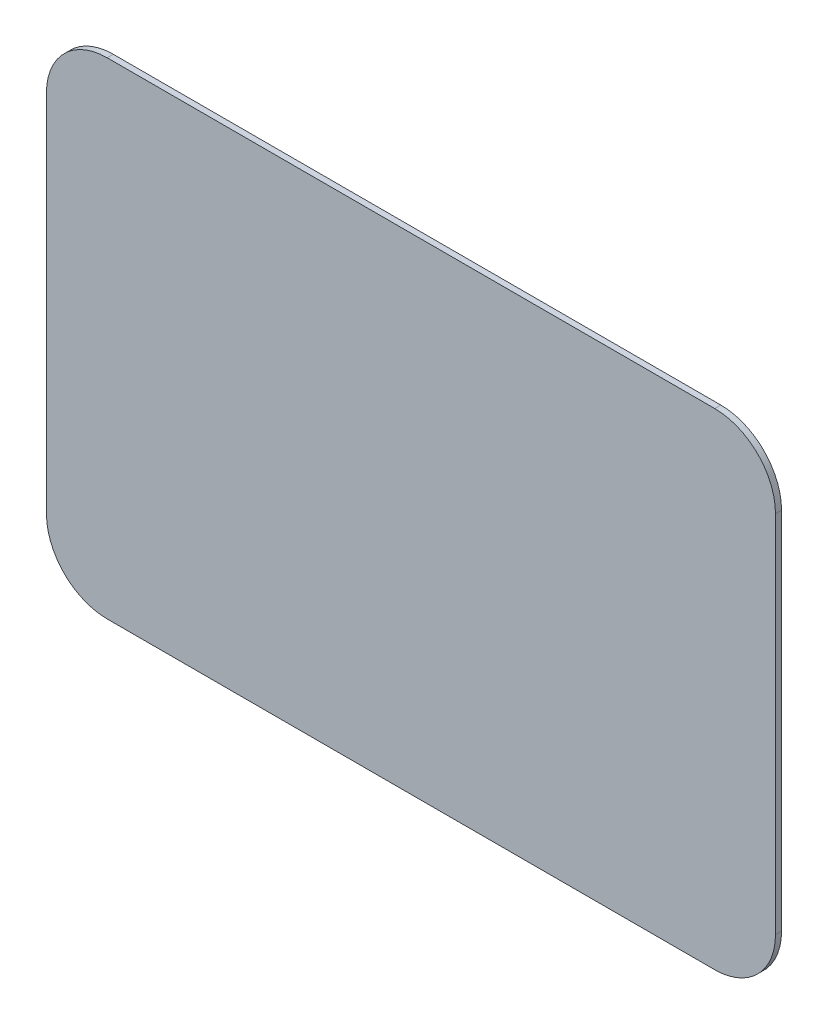
ISO-10303-21;
HEADER;
FILE_DESCRIPTION(('STEP AP214'),'2;1');
FILE_NAME('part.step','',(''),(''),'','','');
FILE_SCHEMA(('AUTOMOTIVE_DESIGN { 1 0 10303 214 1 1 1 1 }'));
ENDSEC;
DATA;
#1=APPLICATION_CONTEXT('core data for automotive mechanical design processes');
#2=APPLICATION_PROTOCOL_DEFINITION('international standard','automotive_design',2000,#1);
#3=PRODUCT_CONTEXT('',#1,'mechanical');
#4=PRODUCT('Part','Part','',(#3));
#5=PRODUCT_RELATED_PRODUCT_CATEGORY('part','',(#4));
#6=PRODUCT_DEFINITION_FORMATION('','',#4);
#7=PRODUCT_DEFINITION_CONTEXT('part definition',#1,'design');
#8=PRODUCT_DEFINITION('design','',#6,#7);
#9=PRODUCT_DEFINITION_SHAPE('','',#8);
#10=(LENGTH_UNIT() NAMED_UNIT(*) SI_UNIT(.MILLI.,.METRE.));
#11=(NAMED_UNIT(*) PLANE_ANGLE_UNIT() SI_UNIT($,.RADIAN.));
#12=(NAMED_UNIT(*) SI_UNIT($,.STERADIAN.) SOLID_ANGLE_UNIT());
#13=UNCERTAINTY_MEASURE_WITH_UNIT(LENGTH_MEASURE(1.E-05),#10,'distance_accuracy_value','');
#14=(GEOMETRIC_REPRESENTATION_CONTEXT(3) GLOBAL_UNCERTAINTY_ASSIGNED_CONTEXT((#13)) GLOBAL_UNIT_ASSIGNED_CONTEXT((#10,
#11,#12)) REPRESENTATION_CONTEXT('',''));
#15=CARTESIAN_POINT('',(0.,0.,0.));
#16=DIRECTION('',(0.,0.,1.));
#17=DIRECTION('',(1.,0.,0.));
#18=AXIS2_PLACEMENT_3D('',#15,#16,#17);
#19=CARTESIAN_POINT('',(-6.,-4.,0.1));
#20=DIRECTION('',(0.,0.,1.));
#21=DIRECTION('',(1.,0.,0.));
#22=AXIS2_PLACEMENT_3D('',#19,#20,#21);
#23=PLANE('',#22);
#24=DIRECTION('',(0.,1.,0.));
#25=VECTOR('',#24,1.);
#26=CARTESIAN_POINT('',(-6.,4.,0.1));
#27=LINE('',#26,#25);
#28=CARTESIAN_POINT('',(-6.,3.,0.1));
#29=VERTEX_POINT('',#28);
#30=CARTESIAN_POINT('',(-6.,-3.,0.1));
#31=VERTEX_POINT('',#30);
#32=EDGE_CURVE('E110',#29,#31,#27,.F.);
#33=ORIENTED_EDGE('',*,*,#32,.T.);
#34=CARTESIAN_POINT('',(-5.,-3.,0.1));
#35=DIRECTION('',(0.,0.,-1.));
#36=DIRECTION('',(-1.,0.,0.));
#37=AXIS2_PLACEMENT_3D('',#34,#35,#36);
#38=CIRCLE('',#37,1.);
#39=CARTESIAN_POINT('',(-5.,-4.,0.1));
#40=VERTEX_POINT('',#39);
#41=EDGE_CURVE('E111',#40,#31,#38,.T.);
#42=ORIENTED_EDGE('',*,*,#41,.F.);
#43=DIRECTION('',(1.,0.,0.));
#44=VECTOR('',#43,1.);
#45=CARTESIAN_POINT('',(-6.,-4.,0.1));
#46=LINE('',#45,#44);
#47=CARTESIAN_POINT('',(5.,-4.,0.1));
#48=VERTEX_POINT('',#47);
#49=EDGE_CURVE('E105',#40,#48,#46,.T.);
#50=ORIENTED_EDGE('',*,*,#49,.T.);
#51=CARTESIAN_POINT('',(5.00000000000001,-3.,0.1));
#52=DIRECTION('',(0.,0.,-1.));
#53=DIRECTION('',(-1.,0.,0.));
#54=AXIS2_PLACEMENT_3D('',#51,#52,#53);
#55=CIRCLE('',#54,1.);
#56=CARTESIAN_POINT('',(6.00000000000001,-3.,0.1));
#57=VERTEX_POINT('',#56);
#58=EDGE_CURVE('E108',#57,#48,#55,.T.);
#59=ORIENTED_EDGE('',*,*,#58,.F.);
#60=DIRECTION('',(0.,1.,0.));
#61=VECTOR('',#60,1.);
#62=CARTESIAN_POINT('',(6.00000000000001,4.,0.1));
#63=LINE('',#62,#61);
#64=CARTESIAN_POINT('',(6.00000000000001,3.,0.1));
#65=VERTEX_POINT('',#64);
#66=EDGE_CURVE('E84',#57,#65,#63,.T.);
#67=ORIENTED_EDGE('',*,*,#66,.T.);
#68=CARTESIAN_POINT('',(5.,3.,0.1));
#69=DIRECTION('',(0.,0.,-1.));
#70=DIRECTION('',(-1.,0.,0.));
#71=AXIS2_PLACEMENT_3D('',#68,#69,#70);
#72=CIRCLE('',#71,1.);
#73=CARTESIAN_POINT('',(5.,4.,0.1));
#74=VERTEX_POINT('',#73);
#75=EDGE_CURVE('E20',#74,#65,#72,.T.);
#76=ORIENTED_EDGE('',*,*,#75,.F.);
#77=DIRECTION('',(1.,0.,0.));
#78=VECTOR('',#77,1.);
#79=CARTESIAN_POINT('',(-6.,4.,0.1));
#80=LINE('',#79,#78);
#81=CARTESIAN_POINT('',(-5.,4.,0.1));
#82=VERTEX_POINT('',#81);
#83=EDGE_CURVE('E82',#74,#82,#80,.F.);
#84=ORIENTED_EDGE('',*,*,#83,.T.);
#85=CARTESIAN_POINT('',(-5.,3.,0.1));
#86=DIRECTION('',(0.,0.,-1.));
#87=DIRECTION('',(-1.,0.,0.));
#88=AXIS2_PLACEMENT_3D('',#85,#86,#87);
#89=CIRCLE('',#88,1.);
#90=EDGE_CURVE('E95',#29,#82,#89,.T.);
#91=ORIENTED_EDGE('',*,*,#90,.F.);
#92=EDGE_LOOP('',(#33,#42,#50,#59,#67,#76,#84,#91));
#93=FACE_BOUND('',#92,.T.);
#94=ADVANCED_FACE('F17',(#93),#23,.T.);
#95=CARTESIAN_POINT('',(5.,3.,0.1));
#96=DIRECTION('',(0.,0.,-1.));
#97=DIRECTION('',(-1.,0.,0.));
#98=AXIS2_PLACEMENT_3D('',#95,#96,#97);
#99=CYLINDRICAL_SURFACE('',#98,1.);
#100=CARTESIAN_POINT('',(5.,3.,0.));
#101=DIRECTION('',(0.,0.,-1.));
#102=DIRECTION('',(-1.,0.,0.));
#103=AXIS2_PLACEMENT_3D('',#100,#101,#102);
#104=CIRCLE('',#103,1.);
#105=CARTESIAN_POINT('',(6.00000000000001,3.,0.));
#106=VERTEX_POINT('',#105);
#107=CARTESIAN_POINT('',(5.,4.,0.));
#108=VERTEX_POINT('',#107);
#109=EDGE_CURVE('E99',#106,#108,#104,.F.);
#110=ORIENTED_EDGE('',*,*,#109,.T.);
#111=DIRECTION('',(0.,0.,-1.));
#112=VECTOR('',#111,1.);
#113=CARTESIAN_POINT('',(5.,4.,0.1));
#114=LINE('',#113,#112);
#115=EDGE_CURVE('E89',#108,#74,#114,.F.);
#116=ORIENTED_EDGE('',*,*,#115,.T.);
#117=ORIENTED_EDGE('',*,*,#75,.T.);
#118=DIRECTION('',(0.,0.,1.));
#119=VECTOR('',#118,1.);
#120=CARTESIAN_POINT('',(6.00000000000001,3.,0.1));
#121=LINE('',#120,#119);
#122=EDGE_CURVE('E137',#65,#106,#121,.F.);
#123=ORIENTED_EDGE('',*,*,#122,.T.);
#124=EDGE_LOOP('',(#110,#116,#117,#123));
#125=FACE_BOUND('',#124,.T.);
#126=ADVANCED_FACE('F98',(#125),#99,.T.);
#127=CARTESIAN_POINT('',(-6.,4.,0.1));
#128=DIRECTION('',(0.,-1.,0.));
#129=DIRECTION('',(0.,0.,-1.));
#130=AXIS2_PLACEMENT_3D('',#127,#128,#129);
#131=PLANE('',#130);
#132=ORIENTED_EDGE('',*,*,#115,.F.);
#133=DIRECTION('',(1.,0.,0.));
#134=VECTOR('',#133,1.);
#135=CARTESIAN_POINT('',(-6.,4.,0.));
#136=LINE('',#135,#134);
#137=CARTESIAN_POINT('',(-5.,4.,0.));
#138=VERTEX_POINT('',#137);
#139=EDGE_CURVE('E124',#108,#138,#136,.F.);
#140=ORIENTED_EDGE('',*,*,#139,.T.);
#141=DIRECTION('',(0.,0.,-1.));
#142=VECTOR('',#141,1.);
#143=CARTESIAN_POINT('',(-5.,4.,0.1));
#144=LINE('',#143,#142);
#145=EDGE_CURVE('E94',#82,#138,#144,.T.);
#146=ORIENTED_EDGE('',*,*,#145,.F.);
#147=ORIENTED_EDGE('',*,*,#83,.F.);
#148=EDGE_LOOP('',(#132,#140,#146,#147));
#149=FACE_BOUND('',#148,.T.);
#150=ADVANCED_FACE('F91',(#149),#131,.F.);
#151=CARTESIAN_POINT('',(-5.,3.,0.1));
#152=DIRECTION('',(0.,0.,-1.));
#153=DIRECTION('',(-1.,0.,0.));
#154=AXIS2_PLACEMENT_3D('',#151,#152,#153);
#155=CYLINDRICAL_SURFACE('',#154,1.);
#156=CARTESIAN_POINT('',(-5.,3.,0.));
#157=DIRECTION('',(0.,0.,-1.));
#158=DIRECTION('',(-1.,0.,0.));
#159=AXIS2_PLACEMENT_3D('',#156,#157,#158);
#160=CIRCLE('',#159,1.);
#161=CARTESIAN_POINT('',(-6.,3.,0.));
#162=VERTEX_POINT('',#161);
#163=EDGE_CURVE('E121',#138,#162,#160,.F.);
#164=ORIENTED_EDGE('',*,*,#163,.T.);
#165=DIRECTION('',(0.,0.,-1.));
#166=VECTOR('',#165,1.);
#167=CARTESIAN_POINT('',(-6.,3.,0.1));
#168=LINE('',#167,#166);
#169=EDGE_CURVE('E112',#162,#29,#168,.F.);
#170=ORIENTED_EDGE('',*,*,#169,.T.);
#171=ORIENTED_EDGE('',*,*,#90,.T.);
#172=ORIENTED_EDGE('',*,*,#145,.T.);
#173=EDGE_LOOP('',(#164,#170,#171,#172));
#174=FACE_BOUND('',#173,.T.);
#175=ADVANCED_FACE('F160',(#174),#155,.T.);
#176=CARTESIAN_POINT('',(-6.,4.,0.1));
#177=DIRECTION('',(1.,0.,0.));
#178=DIRECTION('',(0.,0.,-1.));
#179=AXIS2_PLACEMENT_3D('',#176,#177,#178);
#180=PLANE('',#179);
#181=ORIENTED_EDGE('',*,*,#169,.F.);
#182=DIRECTION('',(0.,1.,0.));
#183=VECTOR('',#182,1.);
#184=CARTESIAN_POINT('',(-6.,-4.,0.));
#185=LINE('',#184,#183);
#186=CARTESIAN_POINT('',(-6.,-3.,0.));
#187=VERTEX_POINT('',#186);
#188=EDGE_CURVE('E120',#162,#187,#185,.F.);
#189=ORIENTED_EDGE('',*,*,#188,.T.);
#190=DIRECTION('',(0.,0.,-1.));
#191=VECTOR('',#190,1.);
#192=CARTESIAN_POINT('',(-6.,-3.,0.1));
#193=LINE('',#192,#191);
#194=EDGE_CURVE('E128',#31,#187,#193,.T.);
#195=ORIENTED_EDGE('',*,*,#194,.F.);
#196=ORIENTED_EDGE('',*,*,#32,.F.);
#197=EDGE_LOOP('',(#181,#189,#195,#196));
#198=FACE_BOUND('',#197,.T.);
#199=ADVANCED_FACE('F159',(#198),#180,.F.);
#200=CARTESIAN_POINT('',(-5.,-3.,0.1));
#201=DIRECTION('',(0.,0.,-1.));
#202=DIRECTION('',(-1.,0.,0.));
#203=AXIS2_PLACEMENT_3D('',#200,#201,#202);
#204=CYLINDRICAL_SURFACE('',#203,1.);
#205=CARTESIAN_POINT('',(-5.,-3.,0.));
#206=DIRECTION('',(0.,0.,-1.));
#207=DIRECTION('',(-1.,0.,0.));
#208=AXIS2_PLACEMENT_3D('',#205,#206,#207);
#209=CIRCLE('',#208,1.);
#210=CARTESIAN_POINT('',(-5.,-4.,0.));
#211=VERTEX_POINT('',#210);
#212=EDGE_CURVE('E117',#187,#211,#209,.F.);
#213=ORIENTED_EDGE('',*,*,#212,.T.);
#214=DIRECTION('',(0.,0.,1.));
#215=VECTOR('',#214,1.);
#216=CARTESIAN_POINT('',(-5.,-4.,0.1));
#217=LINE('',#216,#215);
#218=EDGE_CURVE('E109',#211,#40,#217,.T.);
#219=ORIENTED_EDGE('',*,*,#218,.T.);
#220=ORIENTED_EDGE('',*,*,#41,.T.);
#221=ORIENTED_EDGE('',*,*,#194,.T.);
#222=EDGE_LOOP('',(#213,#219,#220,#221));
#223=FACE_BOUND('',#222,.T.);
#224=ADVANCED_FACE('F155',(#223),#204,.T.);
#225=CARTESIAN_POINT('',(-6.,-4.,0.1));
#226=DIRECTION('',(0.,1.,0.));
#227=DIRECTION('',(0.,0.,1.));
#228=AXIS2_PLACEMENT_3D('',#225,#226,#227);
#229=PLANE('',#228);
#230=DIRECTION('',(0.,0.,-1.));
#231=VECTOR('',#230,1.);
#232=CARTESIAN_POINT('',(5.,-4.,0.1));
#233=LINE('',#232,#231);
#234=CARTESIAN_POINT('',(5.,-4.,0.));
#235=VERTEX_POINT('',#234);
#236=EDGE_CURVE('E127',#48,#235,#233,.T.);
#237=ORIENTED_EDGE('',*,*,#236,.F.);
#238=ORIENTED_EDGE('',*,*,#49,.F.);
#239=ORIENTED_EDGE('',*,*,#218,.F.);
#240=DIRECTION('',(1.,0.,0.));
#241=VECTOR('',#240,1.);
#242=CARTESIAN_POINT('',(-6.,-4.,0.));
#243=LINE('',#242,#241);
#244=EDGE_CURVE('E116',#211,#235,#243,.T.);
#245=ORIENTED_EDGE('',*,*,#244,.T.);
#246=EDGE_LOOP('',(#237,#238,#239,#245));
#247=FACE_BOUND('',#246,.T.);
#248=ADVANCED_FACE('F147',(#247),#229,.F.);
#249=CARTESIAN_POINT('',(5.00000000000001,-3.,0.1));
#250=DIRECTION('',(0.,0.,-1.));
#251=DIRECTION('',(-1.,0.,0.));
#252=AXIS2_PLACEMENT_3D('',#249,#250,#251);
#253=CYLINDRICAL_SURFACE('',#252,1.);
#254=CARTESIAN_POINT('',(5.00000000000001,-3.,0.));
#255=DIRECTION('',(0.,0.,-1.));
#256=DIRECTION('',(-1.,0.,0.));
#257=AXIS2_PLACEMENT_3D('',#254,#255,#256);
#258=CIRCLE('',#257,1.);
#259=CARTESIAN_POINT('',(6.00000000000001,-3.,0.));
#260=VERTEX_POINT('',#259);
#261=EDGE_CURVE('E26',#235,#260,#258,.F.);
#262=ORIENTED_EDGE('',*,*,#261,.T.);
#263=DIRECTION('',(0.,0.,1.));
#264=VECTOR('',#263,1.);
#265=CARTESIAN_POINT('',(6.00000000000001,-3.,0.1));
#266=LINE('',#265,#264);
#267=EDGE_CURVE('E34',#260,#57,#266,.T.);
#268=ORIENTED_EDGE('',*,*,#267,.T.);
#269=ORIENTED_EDGE('',*,*,#58,.T.);
#270=ORIENTED_EDGE('',*,*,#236,.T.);
#271=EDGE_LOOP('',(#262,#268,#269,#270));
#272=FACE_BOUND('',#271,.T.);
#273=ADVANCED_FACE('F176',(#272),#253,.T.);
#274=CARTESIAN_POINT('',(6.00000000000001,4.,0.1));
#275=DIRECTION('',(-1.,0.,0.));
#276=DIRECTION('',(0.,0.,1.));
#277=AXIS2_PLACEMENT_3D('',#274,#275,#276);
#278=PLANE('',#277);
#279=ORIENTED_EDGE('',*,*,#267,.F.);
#280=DIRECTION('',(0.,1.,0.));
#281=VECTOR('',#280,1.);
#282=CARTESIAN_POINT('',(6.00000000000001,-4.,0.));
#283=LINE('',#282,#281);
#284=EDGE_CURVE('E11',#260,#106,#283,.T.);
#285=ORIENTED_EDGE('',*,*,#284,.T.);
#286=ORIENTED_EDGE('',*,*,#122,.F.);
#287=ORIENTED_EDGE('',*,*,#66,.F.);
#288=EDGE_LOOP('',(#279,#285,#286,#287));
#289=FACE_BOUND('',#288,.T.);
#290=ADVANCED_FACE('F171',(#289),#278,.F.);
#291=CARTESIAN_POINT('',(-6.,-4.,0.));
#292=DIRECTION('',(0.,0.,1.));
#293=DIRECTION('',(1.,0.,0.));
#294=AXIS2_PLACEMENT_3D('',#291,#292,#293);
#295=PLANE('',#294);
#296=ORIENTED_EDGE('',*,*,#261,.F.);
#297=ORIENTED_EDGE('',*,*,#244,.F.);
#298=ORIENTED_EDGE('',*,*,#212,.F.);
#299=ORIENTED_EDGE('',*,*,#188,.F.);
#300=ORIENTED_EDGE('',*,*,#163,.F.);
#301=ORIENTED_EDGE('',*,*,#139,.F.);
#302=ORIENTED_EDGE('',*,*,#109,.F.);
#303=ORIENTED_EDGE('',*,*,#284,.F.);
#304=EDGE_LOOP('',(#296,#297,#298,#299,#300,#301,#302,#303));
#305=FACE_BOUND('',#304,.T.);
#306=ADVANCED_FACE('F152',(#305),#295,.F.);
#307=CLOSED_SHELL('',(#94,#126,#150,#175,#199,#224,#248,#273,#290,#306));
#308=MANIFOLD_SOLID_BREP('B1',#307);
#309=ADVANCED_BREP_SHAPE_REPRESENTATION('',(#18,#308),#14);
#310=SHAPE_DEFINITION_REPRESENTATION(#9,#309);
ENDSEC;
END-ISO-10303-21;
